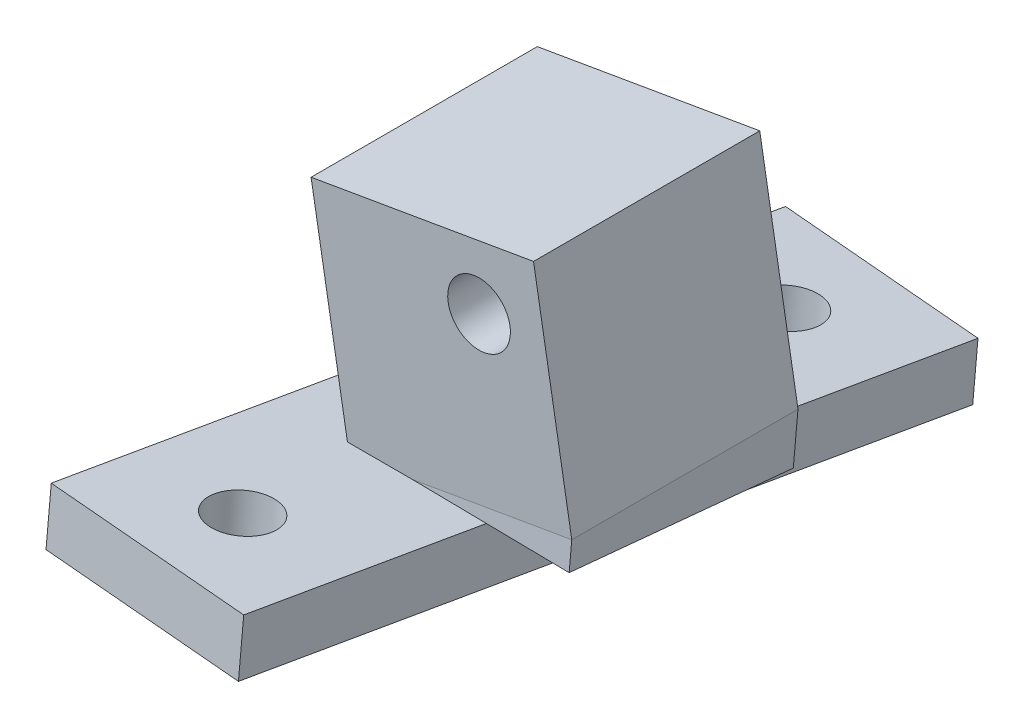
ISO-10303-21;
HEADER;
FILE_DESCRIPTION(('STEP AP214'),'2;1');
FILE_NAME('part.step','',(''),(''),'','','');
FILE_SCHEMA(('AUTOMOTIVE_DESIGN { 1 0 10303 214 1 1 1 1 }'));
ENDSEC;
DATA;
#1=APPLICATION_CONTEXT('core data for automotive mechanical design processes');
#2=APPLICATION_PROTOCOL_DEFINITION('international standard','automotive_design',2000,#1);
#3=PRODUCT_CONTEXT('',#1,'mechanical');
#4=PRODUCT('Part','Part','',(#3));
#5=PRODUCT_RELATED_PRODUCT_CATEGORY('part','',(#4));
#6=PRODUCT_DEFINITION_FORMATION('','',#4);
#7=PRODUCT_DEFINITION_CONTEXT('part definition',#1,'design');
#8=PRODUCT_DEFINITION('design','',#6,#7);
#9=PRODUCT_DEFINITION_SHAPE('','',#8);
#10=(LENGTH_UNIT() NAMED_UNIT(*) SI_UNIT(.MILLI.,.METRE.));
#11=(NAMED_UNIT(*) PLANE_ANGLE_UNIT() SI_UNIT($,.RADIAN.));
#12=(NAMED_UNIT(*) SI_UNIT($,.STERADIAN.) SOLID_ANGLE_UNIT());
#13=UNCERTAINTY_MEASURE_WITH_UNIT(LENGTH_MEASURE(1.E-05),#10,'distance_accuracy_value','');
#14=(GEOMETRIC_REPRESENTATION_CONTEXT(3) GLOBAL_UNCERTAINTY_ASSIGNED_CONTEXT((#13)) GLOBAL_UNIT_ASSIGNED_CONTEXT((#10,
#11,#12)) REPRESENTATION_CONTEXT('',''));
#15=CARTESIAN_POINT('',(0.,0.,0.));
#16=DIRECTION('',(0.,0.,1.));
#17=DIRECTION('',(1.,0.,0.));
#18=AXIS2_PLACEMENT_3D('',#15,#16,#17);
#19=CARTESIAN_POINT('',(0.,235.555558991537,-22.5887570954677));
#20=DIRECTION('',(0.,0.995433481844849,-0.0954577562183398));
#21=DIRECTION('',(0.,0.0954577562183398,0.995433481844849));
#22=AXIS2_PLACEMENT_3D('',#19,#20,#21);
#23=PLANE('',#22);
#24=CARTESIAN_POINT('',(-291.422354653194,236.315962892812,-14.6592652129741));
#25=DIRECTION('',(0.,0.995433481844849,-0.0954577562183399));
#26=DIRECTION('',(0.,0.0954577562183399,0.995433481844849));
#27=AXIS2_PLACEMENT_3D('',#24,#25,#26);
#28=CIRCLE('',#27,3.17499999999997);
#29=CARTESIAN_POINT('',(-291.422354653194,236.619041268805,-11.4987639081167));
#30=VERTEX_POINT('',#29);
#31=EDGE_CURVE('E207',#30,#30,#28,.T.);
#32=ORIENTED_EDGE('',*,*,#31,.F.);
#33=EDGE_LOOP('',(#32));
#34=FACE_BOUND('',#33,.T.);
#35=CARTESIAN_POINT('',(-296.162204046571,241.144062791592,35.6881605315018));
#36=DIRECTION('',(0.,0.995433481844849,-0.0954577562183399));
#37=DIRECTION('',(0.,0.0954577562183399,0.995433481844849));
#38=AXIS2_PLACEMENT_3D('',#35,#36,#37);
#39=CIRCLE('',#38,3.17499999999997);
#40=CARTESIAN_POINT('',(-296.162204046571,241.447141167585,38.8486618363591));
#41=VERTEX_POINT('',#40);
#42=EDGE_CURVE('E174',#41,#41,#39,.T.);
#43=ORIENTED_EDGE('',*,*,#42,.F.);
#44=EDGE_LOOP('',(#43));
#45=FACE_BOUND('',#44,.T.);
#46=DIRECTION('',(0.0933041219168695,-0.0950413365901534,-0.991091057962122));
#47=VECTOR('',#46,1.);
#48=CARTESIAN_POINT('',(-286.243769200462,242.085127043808,45.5015785536123));
#49=LINE('',#48,#47);
#50=CARTESIAN_POINT('',(-286.243769200462,242.085127043808,45.5015785536123));
#51=VERTEX_POINT('',#50);
#52=CARTESIAN_POINT('',(-284.128763531221,239.930742418877,23.0356556848355));
#53=VERTEX_POINT('',#52);
#54=EDGE_CURVE('E224',#51,#53,#49,.T.);
#55=ORIENTED_EDGE('',*,*,#54,.T.);
#56=DIRECTION('',(0.999864922564617,0.001568927793334,0.016360779028882));
#57=VECTOR('',#56,1.);
#58=CARTESIAN_POINT('',(-0.829967112008683,240.3752778211,27.6712708592076));
#59=LINE('',#58,#57);
#60=CARTESIAN_POINT('',(-291.759134886362,239.918769299886,22.9108));
#61=VERTEX_POINT('',#60);
#62=EDGE_CURVE('E197',#61,#53,#59,.T.);
#63=ORIENTED_EDGE('',*,*,#62,.F.);
#64=DIRECTION('',(1.,0.,0.));
#65=VECTOR('',#64,1.);
#66=CARTESIAN_POINT('',(-259.570136956663,239.918769299886,22.9108));
#67=LINE('',#66,#65);
#68=CARTESIAN_POINT('',(-298.327559578145,239.918769299886,22.9108));
#69=VERTEX_POINT('',#68);
#70=EDGE_CURVE('E12',#69,#61,#67,.T.);
#71=ORIENTED_EDGE('',*,*,#70,.F.);
#72=DIRECTION('',(-0.0164358335612344,0.0954448620294424,0.995299021243027));
#73=VECTOR('',#72,1.);
#74=CARTESIAN_POINT('',(-298.972361768357,243.663213161028,61.9578605839861));
#75=LINE('',#74,#73);
#76=CARTESIAN_POINT('',(-298.138391254095,238.820246093135,11.4553999999998));
#77=VERTEX_POINT('',#76);
#78=EDGE_CURVE('E255',#77,#69,#75,.T.);
#79=ORIENTED_EDGE('',*,*,#78,.F.);
#80=DIRECTION('',(0.,0.0954577562183397,0.995433481844849));
#81=VECTOR('',#80,1.);
#82=CARTESIAN_POINT('',(-298.138391254095,235.555558991537,-22.5887570954676));
#83=LINE('',#82,#81);
#84=CARTESIAN_POINT('',(-298.138391254095,237.731732831118,0.104383703684056));
#85=VERTEX_POINT('',#84);
#86=EDGE_CURVE('E93',#85,#77,#83,.T.);
#87=ORIENTED_EDGE('',*,*,#86,.F.);
#88=DIRECTION('',(-0.999864922564617,-0.00156892779333396,-0.0163607790288816));
#89=VECTOR('',#88,1.);
#90=CARTESIAN_POINT('',(-0.455179208061911,238.198839391662,4.97537091703746));
#91=LINE('',#90,#89);
#92=CARTESIAN_POINT('',(-281.994817078526,237.757064355043,0.368540835174745));
#93=VERTEX_POINT('',#92);
#94=EDGE_CURVE('E175',#93,#85,#91,.T.);
#95=ORIENTED_EDGE('',*,*,#94,.F.);
#96=CARTESIAN_POINT('',(-279.844972519403,235.567192180455,-22.4674462014301));
#97=VERTEX_POINT('',#96);
#98=EDGE_CURVE('E248',#93,#97,#49,.T.);
#99=ORIENTED_EDGE('',*,*,#98,.T.);
#100=DIRECTION('',(-0.995637655391419,-0.0089066021241071,-0.0928780469501854));
#101=VECTOR('',#100,1.);
#102=CARTESIAN_POINT('',(-301.340789499304,235.374898640596,-24.4726832350846));
#103=LINE('',#102,#101);
#104=CARTESIAN_POINT('',(-301.340789499304,235.374898640596,-24.4726832350846));
#105=VERTEX_POINT('',#104);
#106=EDGE_CURVE('E215',#97,#105,#103,.T.);
#107=ORIENTED_EDGE('',*,*,#106,.T.);
#108=DIRECTION('',(-0.0933041219168688,0.0950413365901539,0.991091057962122));
#109=VECTOR('',#108,1.);
#110=CARTESIAN_POINT('',(-301.340789499304,235.374898640596,-24.4726832350846));
#111=LINE('',#110,#109);
#112=CARTESIAN_POINT('',(-307.739586180362,241.892833503948,43.4963415199578));
#113=VERTEX_POINT('',#112);
#114=EDGE_CURVE('E240',#105,#113,#111,.T.);
#115=ORIENTED_EDGE('',*,*,#114,.T.);
#116=DIRECTION('',(0.995637655391419,0.00890660212410584,0.0928780469501861));
#117=VECTOR('',#116,1.);
#118=CARTESIAN_POINT('',(-307.739586180362,241.892833503948,43.4963415199578));
#119=LINE('',#118,#117);
#120=EDGE_CURVE('E244',#113,#51,#119,.T.);
#121=ORIENTED_EDGE('',*,*,#120,.T.);
#122=EDGE_LOOP('',(#55,#63,#71,#79,#87,#95,#99,#107,#115,#121));
#123=FACE_BOUND('',#122,.T.);
#124=ADVANCED_FACE('F77',(#34,#45,#123),#23,.T.);
#125=CARTESIAN_POINT('',(0.,0.,0.));
#126=DIRECTION('',(0.,0.,1.));
#127=DIRECTION('',(1.,0.,0.));
#128=AXIS2_PLACEMENT_3D('',#125,#126,#127);
#129=PLANE('',#128);
#130=DIRECTION('',(-0.169704592639976,0.985494977783702,0.));
#131=VECTOR('',#130,1.);
#132=CARTESIAN_POINT('',(-275.609976061959,242.699693080885,0.));
#133=LINE('',#132,#131);
#134=CARTESIAN_POINT('',(-275.609976061959,242.699693080885,0.));
#135=VERTEX_POINT('',#134);
#136=CARTESIAN_POINT('',(-279.480965908784,265.17899663863,0.));
#137=VERTEX_POINT('',#136);
#138=EDGE_CURVE('E282',#135,#137,#133,.T.);
#139=ORIENTED_EDGE('',*,*,#138,.F.);
#140=DIRECTION('',(0.985494977783703,0.169704592639974,0.));
#141=VECTOR('',#140,1.);
#142=CARTESIAN_POINT('',(-298.138391254095,238.820246093135,0.));
#143=LINE('',#142,#141);
#144=CARTESIAN_POINT('',(-298.138391254095,238.820246093135,0.));
#145=VERTEX_POINT('',#144);
#146=EDGE_CURVE('E183',#145,#135,#143,.T.);
#147=ORIENTED_EDGE('',*,*,#146,.F.);
#148=DIRECTION('',(0.169704592639977,-0.985494977783702,0.));
#149=VECTOR('',#148,1.);
#150=CARTESIAN_POINT('',(-302.009381100919,261.29954965088,0.));
#151=LINE('',#150,#149);
#152=CARTESIAN_POINT('',(-302.009381100919,261.29954965088,0.));
#153=VERTEX_POINT('',#152);
#154=EDGE_CURVE('E271',#153,#145,#151,.T.);
#155=ORIENTED_EDGE('',*,*,#154,.F.);
#156=DIRECTION('',(-0.985494977783702,-0.169704592639978,0.));
#157=VECTOR('',#156,1.);
#158=CARTESIAN_POINT('',(-279.480965908784,265.17899663863,0.));
#159=LINE('',#158,#157);
#160=EDGE_CURVE('E276',#137,#153,#159,.T.);
#161=ORIENTED_EDGE('',*,*,#160,.F.);
#162=EDGE_LOOP('',(#139,#147,#155,#161));
#163=FACE_BOUND('',#162,.T.);
#164=CARTESIAN_POINT('',(-284.999999999996,257.808220007844,0.));
#165=DIRECTION('',(0.,0.,1.));
#166=DIRECTION('',(1.,0.,0.));
#167=AXIS2_PLACEMENT_3D('',#164,#165,#166);
#168=CIRCLE('',#167,3.17499999999765);
#169=CARTESIAN_POINT('',(-281.824999999998,257.808220007844,0.));
#170=VERTEX_POINT('',#169);
#171=EDGE_CURVE('E267',#170,#170,#168,.T.);
#172=ORIENTED_EDGE('',*,*,#171,.T.);
#173=EDGE_LOOP('',(#172));
#174=FACE_BOUND('',#173,.T.);
#175=ADVANCED_FACE('F323',(#163,#174),#129,.F.);
#176=CARTESIAN_POINT('',(-275.609976061959,242.699693080885,60.2164606526505));
#177=DIRECTION('',(-0.985494977783702,-0.169704592639976,0.));
#178=DIRECTION('',(0.169704592639976,-0.985494977783702,0.));
#179=AXIS2_PLACEMENT_3D('',#176,#177,#178);
#180=PLANE('',#179);
#181=DIRECTION('',(0.,0.,-1.));
#182=VECTOR('',#181,1.);
#183=CARTESIAN_POINT('',(-279.480965908784,265.17899663863,60.2164606526505));
#184=LINE('',#183,#182);
#185=CARTESIAN_POINT('',(-279.480965908784,265.17899663863,22.9108));
#186=VERTEX_POINT('',#185);
#187=EDGE_CURVE('E281',#186,#137,#184,.T.);
#188=ORIENTED_EDGE('',*,*,#187,.F.);
#189=DIRECTION('',(0.169704592639976,-0.985494977783702,0.));
#190=VECTOR('',#189,1.);
#191=CARTESIAN_POINT('',(-275.609976061959,242.699693080885,22.9108));
#192=LINE('',#191,#190);
#193=CARTESIAN_POINT('',(-275.609976061959,242.699693080885,22.9108));
#194=VERTEX_POINT('',#193);
#195=EDGE_CURVE('E291',#186,#194,#192,.T.);
#196=ORIENTED_EDGE('',*,*,#195,.T.);
#197=DIRECTION('',(0.,0.,-1.));
#198=VECTOR('',#197,1.);
#199=CARTESIAN_POINT('',(-275.609976061959,242.699693080885,60.2164606526505));
#200=LINE('',#199,#198);
#201=EDGE_CURVE('E287',#194,#135,#200,.T.);
#202=ORIENTED_EDGE('',*,*,#201,.T.);
#203=ORIENTED_EDGE('',*,*,#138,.T.);
#204=EDGE_LOOP('',(#188,#196,#202,#203));
#205=FACE_BOUND('',#204,.T.);
#206=ADVANCED_FACE('F325',(#205),#180,.F.);
#207=CARTESIAN_POINT('',(-279.480965908784,265.17899663863,60.2164606526505));
#208=DIRECTION('',(0.169704592639978,-0.985494977783702,0.));
#209=DIRECTION('',(0.985494977783702,0.169704592639978,0.));
#210=AXIS2_PLACEMENT_3D('',#207,#208,#209);
#211=PLANE('',#210);
#212=DIRECTION('',(0.,0.,-1.));
#213=VECTOR('',#212,1.);
#214=CARTESIAN_POINT('',(-302.009381100919,261.29954965088,60.2164606526505));
#215=LINE('',#214,#213);
#216=CARTESIAN_POINT('',(-302.009381100919,261.29954965088,22.9108));
#217=VERTEX_POINT('',#216);
#218=EDGE_CURVE('E275',#217,#153,#215,.T.);
#219=ORIENTED_EDGE('',*,*,#218,.F.);
#220=DIRECTION('',(0.985494977783702,0.169704592639978,0.));
#221=VECTOR('',#220,1.);
#222=CARTESIAN_POINT('',(-279.480965908784,265.17899663863,22.9108));
#223=LINE('',#222,#221);
#224=EDGE_CURVE('E286',#217,#186,#223,.T.);
#225=ORIENTED_EDGE('',*,*,#224,.T.);
#226=ORIENTED_EDGE('',*,*,#187,.T.);
#227=ORIENTED_EDGE('',*,*,#160,.T.);
#228=EDGE_LOOP('',(#219,#225,#226,#227));
#229=FACE_BOUND('',#228,.T.);
#230=ADVANCED_FACE('F332',(#229),#211,.F.);
#231=CARTESIAN_POINT('',(-302.009381100919,261.29954965088,60.2164606526505));
#232=DIRECTION('',(0.985494977783702,0.169704592639977,0.));
#233=DIRECTION('',(-0.169704592639977,0.985494977783702,0.));
#234=AXIS2_PLACEMENT_3D('',#231,#232,#233);
#235=PLANE('',#234);
#236=DIRECTION('',(0.,0.,-1.));
#237=VECTOR('',#236,1.);
#238=CARTESIAN_POINT('',(-298.138391254095,238.820246093135,60.2164606526505));
#239=LINE('',#238,#237);
#240=EDGE_CURVE('E270',#77,#145,#239,.T.);
#241=ORIENTED_EDGE('',*,*,#240,.F.);
#242=ORIENTED_EDGE('',*,*,#78,.T.);
#243=DIRECTION('',(-0.169704592639977,0.985494977783702,0.));
#244=VECTOR('',#243,1.);
#245=CARTESIAN_POINT('',(-302.009381100919,261.29954965088,22.9108));
#246=LINE('',#245,#244);
#247=EDGE_CURVE('E280',#69,#217,#246,.T.);
#248=ORIENTED_EDGE('',*,*,#247,.T.);
#249=ORIENTED_EDGE('',*,*,#218,.T.);
#250=ORIENTED_EDGE('',*,*,#154,.T.);
#251=EDGE_LOOP('',(#241,#242,#248,#249,#250));
#252=FACE_BOUND('',#251,.T.);
#253=ADVANCED_FACE('F320',(#252),#235,.F.);
#254=CARTESIAN_POINT('',(-284.999999999996,257.808220007844,60.2164606526505));
#255=DIRECTION('',(0.,0.,-1.));
#256=DIRECTION('',(-1.,0.,0.));
#257=AXIS2_PLACEMENT_3D('',#254,#255,#256);
#258=CYLINDRICAL_SURFACE('',#257,3.17499999999765);
#259=CARTESIAN_POINT('',(-284.999999999996,257.808220007844,22.9108));
#260=DIRECTION('',(0.,0.,-1.));
#261=DIRECTION('',(0.,1.,0.));
#262=AXIS2_PLACEMENT_3D('',#259,#260,#261);
#263=CIRCLE('',#262,3.17499999999765);
#264=CARTESIAN_POINT('',(-284.999999999996,260.983220007842,22.9108));
#265=VERTEX_POINT('',#264);
#266=EDGE_CURVE('E86',#265,#265,#263,.T.);
#267=ORIENTED_EDGE('',*,*,#266,.F.);
#268=EDGE_LOOP('',(#267));
#269=FACE_BOUND('',#268,.T.);
#270=ORIENTED_EDGE('',*,*,#171,.F.);
#271=EDGE_LOOP('',(#270));
#272=FACE_BOUND('',#271,.T.);
#273=ADVANCED_FACE('F317',(#269,#272),#258,.F.);
#274=CARTESIAN_POINT('',(-259.570136956663,305.935789375131,22.9108));
#275=DIRECTION('',(0.,0.,-1.));
#276=DIRECTION('',(0.,-1.,0.));
#277=AXIS2_PLACEMENT_3D('',#274,#275,#276);
#278=PLANE('',#277);
#279=ORIENTED_EDGE('',*,*,#266,.T.);
#280=EDGE_LOOP('',(#279));
#281=FACE_BOUND('',#280,.T.);
#282=ORIENTED_EDGE('',*,*,#247,.F.);
#283=ORIENTED_EDGE('',*,*,#70,.T.);
#284=DIRECTION('',(-0.985494977783703,-0.169704592639974,0.));
#285=VECTOR('',#284,1.);
#286=CARTESIAN_POINT('',(-298.138391254095,238.820246093135,22.9108));
#287=LINE('',#286,#285);
#288=EDGE_CURVE('E274',#194,#61,#287,.T.);
#289=ORIENTED_EDGE('',*,*,#288,.F.);
#290=ORIENTED_EDGE('',*,*,#195,.F.);
#291=ORIENTED_EDGE('',*,*,#224,.F.);
#292=EDGE_LOOP('',(#282,#283,#289,#290,#291));
#293=FACE_BOUND('',#292,.T.);
#294=ADVANCED_FACE('F79',(#281,#293),#278,.F.);
#295=CARTESIAN_POINT('',(-301.340789499304,229.812416344047,-23.9392652933365));
#296=DIRECTION('',(0.0933041219168692,-0.0950413365901537,-0.991091057962122));
#297=DIRECTION('',(0.,0.995433481844849,-0.09545775621834));
#298=AXIS2_PLACEMENT_3D('',#295,#296,#297);
#299=PLANE('',#298);
#300=ORIENTED_EDGE('',*,*,#106,.F.);
#301=DIRECTION('',(0.,0.995433481844849,-0.0954577562183399));
#302=VECTOR('',#301,1.);
#303=CARTESIAN_POINT('',(-279.844972519403,230.004709883906,-21.934028259682));
#304=LINE('',#303,#302);
#305=CARTESIAN_POINT('',(-279.844972519403,230.004709883906,-21.934028259682));
#306=VERTEX_POINT('',#305);
#307=EDGE_CURVE('E251',#306,#97,#304,.T.);
#308=ORIENTED_EDGE('',*,*,#307,.F.);
#309=DIRECTION('',(-0.995637655391419,-0.0089066021241071,-0.0928780469501854));
#310=VECTOR('',#309,1.);
#311=CARTESIAN_POINT('',(-301.340789499304,229.812416344047,-23.9392652933365));
#312=LINE('',#311,#310);
#313=CARTESIAN_POINT('',(-301.340789499304,229.812416344047,-23.9392652933365));
#314=VERTEX_POINT('',#313);
#315=EDGE_CURVE('E219',#306,#314,#312,.T.);
#316=ORIENTED_EDGE('',*,*,#315,.T.);
#317=DIRECTION('',(0.,0.995433481844849,-0.0954577562183399));
#318=VECTOR('',#317,1.);
#319=CARTESIAN_POINT('',(-301.340789499304,229.812416344047,-23.9392652933365));
#320=LINE('',#319,#318);
#321=EDGE_CURVE('E236',#314,#105,#320,.T.);
#322=ORIENTED_EDGE('',*,*,#321,.T.);
#323=EDGE_LOOP('',(#300,#308,#316,#322));
#324=FACE_BOUND('',#323,.T.);
#325=ADVANCED_FACE('F340',(#324),#299,.T.);
#326=CARTESIAN_POINT('',(-286.243769200462,236.522644747259,46.0349964953604));
#327=DIRECTION('',(0.995637655391419,0.00890660212410636,0.0928780469501858));
#328=DIRECTION('',(0.092881731063862,0.,-0.995677148494722));
#329=AXIS2_PLACEMENT_3D('',#326,#327,#328);
#330=PLANE('',#329);
#331=ORIENTED_EDGE('',*,*,#54,.F.);
#332=DIRECTION('',(0.,0.995433481844849,-0.0954577562183399));
#333=VECTOR('',#332,1.);
#334=CARTESIAN_POINT('',(-286.243769200462,236.522644747259,46.0349964953604));
#335=LINE('',#334,#333);
#336=CARTESIAN_POINT('',(-286.243769200462,236.522644747259,46.0349964953604));
#337=VERTEX_POINT('',#336);
#338=EDGE_CURVE('E256',#337,#51,#335,.T.);
#339=ORIENTED_EDGE('',*,*,#338,.F.);
#340=DIRECTION('',(0.0933041219168695,-0.0950413365901534,-0.991091057962122));
#341=VECTOR('',#340,1.);
#342=CARTESIAN_POINT('',(-286.243769200462,236.522644747259,46.0349964953604));
#343=LINE('',#342,#341);
#344=EDGE_CURVE('E232',#337,#306,#343,.T.);
#345=ORIENTED_EDGE('',*,*,#344,.T.);
#346=ORIENTED_EDGE('',*,*,#307,.T.);
#347=ORIENTED_EDGE('',*,*,#98,.F.);
#348=EDGE_CURVE('E101',#53,#93,#49,.T.);
#349=ORIENTED_EDGE('',*,*,#348,.F.);
#350=EDGE_LOOP('',(#331,#339,#345,#346,#347,#349));
#351=FACE_BOUND('',#350,.T.);
#352=ADVANCED_FACE('F367',(#351),#330,.T.);
#353=CARTESIAN_POINT('',(-307.739586180362,236.330351207399,44.0297594617059));
#354=DIRECTION('',(-0.0933041219168698,0.0950413365901536,0.991091057962122));
#355=DIRECTION('',(0.,-0.995433481844849,0.09545775621834));
#356=AXIS2_PLACEMENT_3D('',#353,#354,#355);
#357=PLANE('',#356);
#358=ORIENTED_EDGE('',*,*,#120,.F.);
#359=DIRECTION('',(0.,0.995433481844849,-0.0954577562183399));
#360=VECTOR('',#359,1.);
#361=CARTESIAN_POINT('',(-307.739586180362,236.330351207399,44.0297594617059));
#362=LINE('',#361,#360);
#363=CARTESIAN_POINT('',(-307.739586180362,236.330351207399,44.0297594617059));
#364=VERTEX_POINT('',#363);
#365=EDGE_CURVE('E259',#364,#113,#362,.T.);
#366=ORIENTED_EDGE('',*,*,#365,.F.);
#367=DIRECTION('',(0.995637655391419,0.00890660212410584,0.0928780469501861));
#368=VECTOR('',#367,1.);
#369=CARTESIAN_POINT('',(-307.739586180362,236.330351207399,44.0297594617059));
#370=LINE('',#369,#368);
#371=EDGE_CURVE('E228',#364,#337,#370,.T.);
#372=ORIENTED_EDGE('',*,*,#371,.T.);
#373=ORIENTED_EDGE('',*,*,#338,.T.);
#374=EDGE_LOOP('',(#358,#366,#372,#373));
#375=FACE_BOUND('',#374,.T.);
#376=ADVANCED_FACE('F371',(#375),#357,.T.);
#377=CARTESIAN_POINT('',(-301.340789499304,229.812416344047,-23.9392652933365));
#378=DIRECTION('',(-0.995637655391419,-0.00890660212410628,-0.092878046950185));
#379=DIRECTION('',(-0.0928817310638612,0.,0.995677148494722));
#380=AXIS2_PLACEMENT_3D('',#377,#378,#379);
#381=PLANE('',#380);
#382=ORIENTED_EDGE('',*,*,#114,.F.);
#383=ORIENTED_EDGE('',*,*,#321,.F.);
#384=DIRECTION('',(-0.0933041219168688,0.0950413365901539,0.991091057962122));
#385=VECTOR('',#384,1.);
#386=CARTESIAN_POINT('',(-301.340789499304,229.812416344047,-23.9392652933365));
#387=LINE('',#386,#385);
#388=EDGE_CURVE('E223',#314,#364,#387,.T.);
#389=ORIENTED_EDGE('',*,*,#388,.T.);
#390=ORIENTED_EDGE('',*,*,#365,.T.);
#391=EDGE_LOOP('',(#382,#383,#389,#390));
#392=FACE_BOUND('',#391,.T.);
#393=ADVANCED_FACE('F383',(#392),#381,.T.);
#394=CARTESIAN_POINT('',(0.,229.993076694988,-22.0553391537196));
#395=DIRECTION('',(0.,0.995433481844849,-0.0954577562183398));
#396=DIRECTION('',(0.,0.0954577562183398,0.995433481844849));
#397=AXIS2_PLACEMENT_3D('',#394,#395,#396);
#398=PLANE('',#397);
#399=CARTESIAN_POINT('',(-296.162204046571,235.581580495043,36.2215784732498));
#400=DIRECTION('',(0.,0.995433481844849,-0.0954577562183399));
#401=DIRECTION('',(0.,0.0954577562183399,0.995433481844849));
#402=AXIS2_PLACEMENT_3D('',#399,#400,#401);
#403=CIRCLE('',#402,3.17499999999997);
#404=CARTESIAN_POINT('',(-296.162204046571,235.884658871036,39.3820797781072));
#405=VERTEX_POINT('',#404);
#406=EDGE_CURVE('E203',#405,#405,#403,.T.);
#407=ORIENTED_EDGE('',*,*,#406,.T.);
#408=EDGE_LOOP('',(#407));
#409=FACE_BOUND('',#408,.T.);
#410=CARTESIAN_POINT('',(-291.422354653194,230.753480596263,-14.125847271226));
#411=DIRECTION('',(0.,0.995433481844849,-0.0954577562183399));
#412=DIRECTION('',(0.,0.0954577562183399,0.995433481844849));
#413=AXIS2_PLACEMENT_3D('',#410,#411,#412);
#414=CIRCLE('',#413,3.17499999999997);
#415=CARTESIAN_POINT('',(-291.422354653194,231.056558972256,-10.9653459663686));
#416=VERTEX_POINT('',#415);
#417=EDGE_CURVE('E211',#416,#416,#414,.T.);
#418=ORIENTED_EDGE('',*,*,#417,.T.);
#419=EDGE_LOOP('',(#418));
#420=FACE_BOUND('',#419,.T.);
#421=ORIENTED_EDGE('',*,*,#315,.F.);
#422=ORIENTED_EDGE('',*,*,#344,.F.);
#423=ORIENTED_EDGE('',*,*,#371,.F.);
#424=ORIENTED_EDGE('',*,*,#388,.F.);
#425=EDGE_LOOP('',(#421,#422,#423,#424));
#426=FACE_BOUND('',#425,.T.);
#427=ADVANCED_FACE('F375',(#409,#420,#426),#398,.F.);
#428=CARTESIAN_POINT('',(-291.422354653194,230.753480596263,-14.125847271226));
#429=DIRECTION('',(0.,0.995433481844849,-0.0954577562183399));
#430=DIRECTION('',(0.,0.0954577562183399,0.995433481844849));
#431=AXIS2_PLACEMENT_3D('',#428,#429,#430);
#432=CYLINDRICAL_SURFACE('',#431,3.17499999999997);
#433=ORIENTED_EDGE('',*,*,#417,.F.);
#434=EDGE_LOOP('',(#433));
#435=FACE_BOUND('',#434,.T.);
#436=ORIENTED_EDGE('',*,*,#31,.T.);
#437=EDGE_LOOP('',(#436));
#438=FACE_BOUND('',#437,.T.);
#439=ADVANCED_FACE('F389',(#435,#438),#432,.F.);
#440=CARTESIAN_POINT('',(-296.162204046571,235.581580495043,36.2215784732498));
#441=DIRECTION('',(0.,0.995433481844849,-0.0954577562183399));
#442=DIRECTION('',(0.,0.0954577562183399,0.995433481844849));
#443=AXIS2_PLACEMENT_3D('',#440,#441,#442);
#444=CYLINDRICAL_SURFACE('',#443,3.17499999999997);
#445=ORIENTED_EDGE('',*,*,#406,.F.);
#446=EDGE_LOOP('',(#445));
#447=FACE_BOUND('',#446,.T.);
#448=ORIENTED_EDGE('',*,*,#42,.T.);
#449=EDGE_LOOP('',(#448));
#450=FACE_BOUND('',#449,.T.);
#451=ADVANCED_FACE('F398',(#447,#450),#444,.F.);
#452=CARTESIAN_POINT('',(-0.829967112008695,274.782894965084,24.3717295143683));
#453=DIRECTION('',(0.0164358335612344,-0.0954448620294424,-0.995299021243027));
#454=DIRECTION('',(0.,0.995433481844849,-0.0954577562183398));
#455=AXIS2_PLACEMENT_3D('',#452,#453,#454);
#456=PLANE('',#455);
#457=ORIENTED_EDGE('',*,*,#288,.T.);
#458=ORIENTED_EDGE('',*,*,#62,.T.);
#459=CARTESIAN_POINT('',(-275.609976061959,239.944109586906,23.1750485130398));
#460=VERTEX_POINT('',#459);
#461=EDGE_CURVE('E193',#53,#460,#59,.T.);
#462=ORIENTED_EDGE('',*,*,#461,.T.);
#463=DIRECTION('',(0.,-0.995433481844849,0.0954577562183398));
#464=VECTOR('',#463,1.);
#465=CARTESIAN_POINT('',(-275.609976061959,274.351726730891,19.8755071682005));
#466=LINE('',#465,#464);
#467=EDGE_CURVE('E187',#194,#460,#466,.T.);
#468=ORIENTED_EDGE('',*,*,#467,.F.);
#469=EDGE_LOOP('',(#457,#458,#462,#468));
#470=FACE_BOUND('',#469,.T.);
#471=ADVANCED_FACE('F365',(#470),#456,.F.);
#472=CARTESIAN_POINT('',(-0.455179208061923,272.606456535647,1.67582957219812));
#473=DIRECTION('',(-0.0164358335612341,0.0954448620294424,0.995299021243027));
#474=DIRECTION('',(0.,-0.995433481844849,0.0954577562183398));
#475=AXIS2_PLACEMENT_3D('',#472,#473,#474);
#476=PLANE('',#475);
#477=ORIENTED_EDGE('',*,*,#146,.T.);
#478=DIRECTION('',(0.,-0.995433481844849,0.0954577562183398));
#479=VECTOR('',#478,1.);
#480=CARTESIAN_POINT('',(-275.609976061959,272.174700206856,-2.82652542443143));
#481=LINE('',#480,#479);
#482=CARTESIAN_POINT('',(-275.609976061959,237.767083062872,0.47301592040791));
#483=VERTEX_POINT('',#482);
#484=EDGE_CURVE('E179',#135,#483,#481,.T.);
#485=ORIENTED_EDGE('',*,*,#484,.T.);
#486=EDGE_CURVE('E166',#483,#93,#91,.T.);
#487=ORIENTED_EDGE('',*,*,#486,.T.);
#488=ORIENTED_EDGE('',*,*,#94,.T.);
#489=DIRECTION('',(0.,-0.995433481844849,0.0954577562183398));
#490=VECTOR('',#489,1.);
#491=CARTESIAN_POINT('',(-298.138391254095,272.139349975103,-3.1951576411553));
#492=LINE('',#491,#490);
#493=EDGE_CURVE('E201',#145,#85,#492,.T.);
#494=ORIENTED_EDGE('',*,*,#493,.F.);
#495=EDGE_LOOP('',(#477,#485,#487,#488,#494));
#496=FACE_BOUND('',#495,.T.);
#497=ADVANCED_FACE('F180',(#496),#476,.F.);
#498=CARTESIAN_POINT('',(-1.13297532468884E-13,235.555558991537,-22.5887570954676));
#499=DIRECTION('',(0.,0.995433481844849,-0.0954577562183397));
#500=DIRECTION('',(0.,0.0954577562183397,0.995433481844849));
#501=AXIS2_PLACEMENT_3D('',#498,#499,#500);
#502=PLANE('',#501);
#503=ORIENTED_EDGE('',*,*,#348,.T.);
#504=ORIENTED_EDGE('',*,*,#486,.F.);
#505=DIRECTION('',(0.,-0.0954577562183397,-0.995433481844849));
#506=VECTOR('',#505,1.);
#507=CARTESIAN_POINT('',(-275.609976061959,239.944109586906,23.1750485130398));
#508=LINE('',#507,#506);
#509=EDGE_CURVE('E171',#460,#483,#508,.T.);
#510=ORIENTED_EDGE('',*,*,#509,.F.);
#511=ORIENTED_EDGE('',*,*,#461,.F.);
#512=EDGE_LOOP('',(#503,#504,#510,#511));
#513=FACE_BOUND('',#512,.T.);
#514=ADVANCED_FACE('F168',(#513),#502,.F.);
#515=CARTESIAN_POINT('',(-298.138391254095,269.963176135522,-25.888298440307));
#516=DIRECTION('',(1.,0.,0.));
#517=DIRECTION('',(0.,1.,0.));
#518=AXIS2_PLACEMENT_3D('',#515,#516,#517);
#519=PLANE('',#518);
#520=ORIENTED_EDGE('',*,*,#240,.T.);
#521=ORIENTED_EDGE('',*,*,#493,.T.);
#522=ORIENTED_EDGE('',*,*,#86,.T.);
#523=EDGE_LOOP('',(#520,#521,#522));
#524=FACE_BOUND('',#523,.T.);
#525=ADVANCED_FACE('F358',(#524),#519,.F.);
#526=CARTESIAN_POINT('',(-275.609976061959,274.351726730891,19.8755071682005));
#527=DIRECTION('',(-1.,0.,0.));
#528=DIRECTION('',(0.,-1.,0.));
#529=AXIS2_PLACEMENT_3D('',#526,#527,#528);
#530=PLANE('',#529);
#531=ORIENTED_EDGE('',*,*,#201,.F.);
#532=ORIENTED_EDGE('',*,*,#467,.T.);
#533=ORIENTED_EDGE('',*,*,#509,.T.);
#534=ORIENTED_EDGE('',*,*,#484,.F.);
#535=EDGE_LOOP('',(#531,#532,#533,#534));
#536=FACE_BOUND('',#535,.T.);
#537=ADVANCED_FACE('F190',(#536),#530,.F.);
#538=CLOSED_SHELL('',(#124,#175,#206,#230,#253,#273,#294,#325,#352,#376,#393,#427,#439,#451,
#471,#497,#514,#525,#537));
#539=MANIFOLD_SOLID_BREP('B2',#538);
#540=ADVANCED_BREP_SHAPE_REPRESENTATION('',(#18,#539),#14);
#541=SHAPE_DEFINITION_REPRESENTATION(#9,#540);
ENDSEC;
END-ISO-10303-21;
